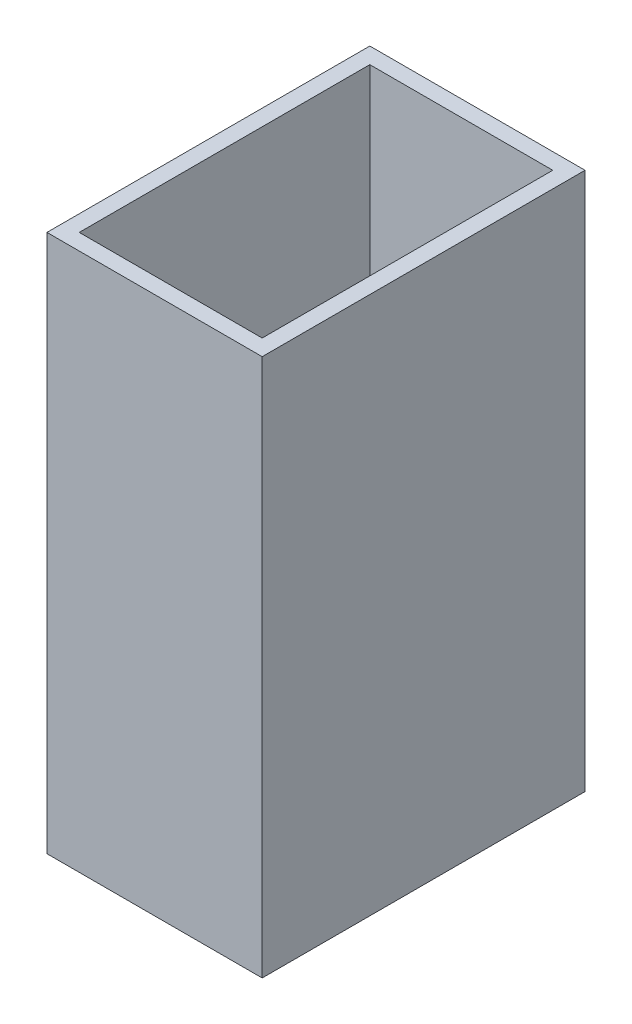
ISO-10303-21;
HEADER;
FILE_DESCRIPTION(('STEP AP214'),'2;1');
FILE_NAME('part.step','',(''),(''),'','','');
FILE_SCHEMA(('AUTOMOTIVE_DESIGN { 1 0 10303 214 1 1 1 1 }'));
ENDSEC;
DATA;
#1=APPLICATION_CONTEXT('core data for automotive mechanical design processes');
#2=APPLICATION_PROTOCOL_DEFINITION('international standard','automotive_design',2000,#1);
#3=PRODUCT_CONTEXT('',#1,'mechanical');
#4=PRODUCT('Part','Part','',(#3));
#5=PRODUCT_RELATED_PRODUCT_CATEGORY('part','',(#4));
#6=PRODUCT_DEFINITION_FORMATION('','',#4);
#7=PRODUCT_DEFINITION_CONTEXT('part definition',#1,'design');
#8=PRODUCT_DEFINITION('design','',#6,#7);
#9=PRODUCT_DEFINITION_SHAPE('','',#8);
#10=(LENGTH_UNIT() NAMED_UNIT(*) SI_UNIT(.MILLI.,.METRE.));
#11=(NAMED_UNIT(*) PLANE_ANGLE_UNIT() SI_UNIT($,.RADIAN.));
#12=(NAMED_UNIT(*) SI_UNIT($,.STERADIAN.) SOLID_ANGLE_UNIT());
#13=UNCERTAINTY_MEASURE_WITH_UNIT(LENGTH_MEASURE(1.E-05),#10,'distance_accuracy_value','');
#14=(GEOMETRIC_REPRESENTATION_CONTEXT(3) GLOBAL_UNCERTAINTY_ASSIGNED_CONTEXT((#13)) GLOBAL_UNIT_ASSIGNED_CONTEXT((#10,
#11,#12)) REPRESENTATION_CONTEXT('',''));
#15=CARTESIAN_POINT('',(0.,0.,0.));
#16=DIRECTION('',(0.,0.,1.));
#17=DIRECTION('',(1.,0.,0.));
#18=AXIS2_PLACEMENT_3D('',#15,#16,#17);
#19=CARTESIAN_POINT('',(0.,100.,0.));
#20=DIRECTION('',(1.,0.,0.));
#21=DIRECTION('',(0.,0.,-1.));
#22=AXIS2_PLACEMENT_3D('',#19,#20,#21);
#23=PLANE('',#22);
#24=DIRECTION('',(0.,0.,1.));
#25=VECTOR('',#24,1.);
#26=CARTESIAN_POINT('',(0.,0.,0.));
#27=LINE('',#26,#25);
#28=CARTESIAN_POINT('',(0.,0.,0.));
#29=VERTEX_POINT('',#28);
#30=CARTESIAN_POINT('',(0.,0.,60.));
#31=VERTEX_POINT('',#30);
#32=EDGE_CURVE('E139',#29,#31,#27,.T.);
#33=ORIENTED_EDGE('',*,*,#32,.T.);
#34=DIRECTION('',(0.,-1.,0.));
#35=VECTOR('',#34,1.);
#36=CARTESIAN_POINT('',(0.,100.,60.));
#37=LINE('',#36,#35);
#38=CARTESIAN_POINT('',(0.,100.,60.));
#39=VERTEX_POINT('',#38);
#40=EDGE_CURVE('E164',#39,#31,#37,.T.);
#41=ORIENTED_EDGE('',*,*,#40,.F.);
#42=DIRECTION('',(0.,0.,1.));
#43=VECTOR('',#42,1.);
#44=CARTESIAN_POINT('',(0.,100.,0.));
#45=LINE('',#44,#43);
#46=CARTESIAN_POINT('',(0.,100.,0.));
#47=VERTEX_POINT('',#46);
#48=EDGE_CURVE('E147',#47,#39,#45,.T.);
#49=ORIENTED_EDGE('',*,*,#48,.F.);
#50=DIRECTION('',(0.,-1.,0.));
#51=VECTOR('',#50,1.);
#52=CARTESIAN_POINT('',(0.,100.,0.));
#53=LINE('',#52,#51);
#54=EDGE_CURVE('E152',#47,#29,#53,.T.);
#55=ORIENTED_EDGE('',*,*,#54,.T.);
#56=EDGE_LOOP('',(#33,#41,#49,#55));
#57=FACE_BOUND('',#56,.T.);
#58=ADVANCED_FACE('F44',(#57),#23,.F.);
#59=CARTESIAN_POINT('',(0.,100.,60.));
#60=DIRECTION('',(0.,0.,-1.));
#61=DIRECTION('',(-1.,0.,0.));
#62=AXIS2_PLACEMENT_3D('',#59,#60,#61);
#63=PLANE('',#62);
#64=DIRECTION('',(1.,0.,0.));
#65=VECTOR('',#64,1.);
#66=CARTESIAN_POINT('',(0.,0.,60.));
#67=LINE('',#66,#65);
#68=CARTESIAN_POINT('',(40.,0.,60.));
#69=VERTEX_POINT('',#68);
#70=EDGE_CURVE('E142',#31,#69,#67,.T.);
#71=ORIENTED_EDGE('',*,*,#70,.T.);
#72=DIRECTION('',(0.,-1.,0.));
#73=VECTOR('',#72,1.);
#74=CARTESIAN_POINT('',(40.,100.,60.));
#75=LINE('',#74,#73);
#76=CARTESIAN_POINT('',(40.,100.,60.));
#77=VERTEX_POINT('',#76);
#78=EDGE_CURVE('E161',#77,#69,#75,.T.);
#79=ORIENTED_EDGE('',*,*,#78,.F.);
#80=DIRECTION('',(1.,0.,0.));
#81=VECTOR('',#80,1.);
#82=CARTESIAN_POINT('',(0.,100.,60.));
#83=LINE('',#82,#81);
#84=EDGE_CURVE('E95',#39,#77,#83,.T.);
#85=ORIENTED_EDGE('',*,*,#84,.F.);
#86=ORIENTED_EDGE('',*,*,#40,.T.);
#87=EDGE_LOOP('',(#71,#79,#85,#86));
#88=FACE_BOUND('',#87,.T.);
#89=ADVANCED_FACE('F187',(#88),#63,.F.);
#90=CARTESIAN_POINT('',(40.,100.,0.));
#91=DIRECTION('',(-1.,0.,0.));
#92=DIRECTION('',(0.,0.,1.));
#93=AXIS2_PLACEMENT_3D('',#90,#91,#92);
#94=PLANE('',#93);
#95=DIRECTION('',(0.,0.,-1.));
#96=VECTOR('',#95,1.);
#97=CARTESIAN_POINT('',(40.,0.,0.));
#98=LINE('',#97,#96);
#99=CARTESIAN_POINT('',(40.,0.,0.));
#100=VERTEX_POINT('',#99);
#101=EDGE_CURVE('E155',#69,#100,#98,.T.);
#102=ORIENTED_EDGE('',*,*,#101,.T.);
#103=DIRECTION('',(0.,-1.,0.));
#104=VECTOR('',#103,1.);
#105=CARTESIAN_POINT('',(40.,100.,0.));
#106=LINE('',#105,#104);
#107=CARTESIAN_POINT('',(40.,100.,0.));
#108=VERTEX_POINT('',#107);
#109=EDGE_CURVE('E159',#108,#100,#106,.T.);
#110=ORIENTED_EDGE('',*,*,#109,.F.);
#111=DIRECTION('',(0.,0.,-1.));
#112=VECTOR('',#111,1.);
#113=CARTESIAN_POINT('',(40.,100.,0.));
#114=LINE('',#113,#112);
#115=EDGE_CURVE('E150',#77,#108,#114,.T.);
#116=ORIENTED_EDGE('',*,*,#115,.F.);
#117=ORIENTED_EDGE('',*,*,#78,.T.);
#118=EDGE_LOOP('',(#102,#110,#116,#117));
#119=FACE_BOUND('',#118,.T.);
#120=ADVANCED_FACE('F192',(#119),#94,.F.);
#121=CARTESIAN_POINT('',(0.,100.,0.));
#122=DIRECTION('',(0.,0.,1.));
#123=DIRECTION('',(1.,0.,0.));
#124=AXIS2_PLACEMENT_3D('',#121,#122,#123);
#125=PLANE('',#124);
#126=DIRECTION('',(-1.,0.,0.));
#127=VECTOR('',#126,1.);
#128=CARTESIAN_POINT('',(0.,0.,0.));
#129=LINE('',#128,#127);
#130=EDGE_CURVE('E87',#100,#29,#129,.T.);
#131=ORIENTED_EDGE('',*,*,#130,.T.);
#132=ORIENTED_EDGE('',*,*,#54,.F.);
#133=DIRECTION('',(-1.,0.,0.));
#134=VECTOR('',#133,1.);
#135=CARTESIAN_POINT('',(0.,100.,0.));
#136=LINE('',#135,#134);
#137=EDGE_CURVE('E66',#108,#47,#136,.T.);
#138=ORIENTED_EDGE('',*,*,#137,.F.);
#139=ORIENTED_EDGE('',*,*,#109,.T.);
#140=EDGE_LOOP('',(#131,#132,#138,#139));
#141=FACE_BOUND('',#140,.T.);
#142=ADVANCED_FACE('F181',(#141),#125,.F.);
#143=CARTESIAN_POINT('',(0.,100.,0.));
#144=DIRECTION('',(0.,1.,0.));
#145=DIRECTION('',(0.,0.,1.));
#146=AXIS2_PLACEMENT_3D('',#143,#144,#145);
#147=PLANE('',#146);
#148=DIRECTION('',(-1.,0.,0.));
#149=VECTOR('',#148,1.);
#150=CARTESIAN_POINT('',(0.,100.,3.));
#151=LINE('',#150,#149);
#152=CARTESIAN_POINT('',(37.,100.,3.));
#153=VERTEX_POINT('',#152);
#154=CARTESIAN_POINT('',(3.,100.,3.));
#155=VERTEX_POINT('',#154);
#156=EDGE_CURVE('E12',#153,#155,#151,.T.);
#157=ORIENTED_EDGE('',*,*,#156,.F.);
#158=DIRECTION('',(0.,0.,-1.));
#159=VECTOR('',#158,1.);
#160=CARTESIAN_POINT('',(37.,100.,0.));
#161=LINE('',#160,#159);
#162=CARTESIAN_POINT('',(37.,100.,57.));
#163=VERTEX_POINT('',#162);
#164=EDGE_CURVE('E51',#163,#153,#161,.T.);
#165=ORIENTED_EDGE('',*,*,#164,.F.);
#166=DIRECTION('',(1.,0.,0.));
#167=VECTOR('',#166,1.);
#168=CARTESIAN_POINT('',(0.,100.,57.));
#169=LINE('',#168,#167);
#170=CARTESIAN_POINT('',(3.00000000000001,100.,57.));
#171=VERTEX_POINT('',#170);
#172=EDGE_CURVE('E167',#171,#163,#169,.T.);
#173=ORIENTED_EDGE('',*,*,#172,.F.);
#174=DIRECTION('',(0.,0.,1.));
#175=VECTOR('',#174,1.);
#176=CARTESIAN_POINT('',(3.,100.,0.));
#177=LINE('',#176,#175);
#178=EDGE_CURVE('E135',#155,#171,#177,.T.);
#179=ORIENTED_EDGE('',*,*,#178,.F.);
#180=EDGE_LOOP('',(#157,#165,#173,#179));
#181=FACE_BOUND('',#180,.T.);
#182=ORIENTED_EDGE('',*,*,#48,.T.);
#183=ORIENTED_EDGE('',*,*,#84,.T.);
#184=ORIENTED_EDGE('',*,*,#115,.T.);
#185=ORIENTED_EDGE('',*,*,#137,.T.);
#186=EDGE_LOOP('',(#182,#183,#184,#185));
#187=FACE_BOUND('',#186,.T.);
#188=ADVANCED_FACE('F178',(#181,#187),#147,.T.);
#189=CARTESIAN_POINT('',(0.,0.,0.));
#190=DIRECTION('',(0.,1.,0.));
#191=DIRECTION('',(0.,0.,1.));
#192=AXIS2_PLACEMENT_3D('',#189,#190,#191);
#193=PLANE('',#192);
#194=CARTESIAN_POINT('',(32.7,0.,12.22));
#195=DIRECTION('',(0.,1.,0.));
#196=DIRECTION('',(0.,0.,1.));
#197=AXIS2_PLACEMENT_3D('',#194,#195,#196);
#198=CIRCLE('',#197,2.5);
#199=CARTESIAN_POINT('',(32.7,0.,14.72));
#200=VERTEX_POINT('',#199);
#201=EDGE_CURVE('E303',#200,#200,#198,.T.);
#202=ORIENTED_EDGE('',*,*,#201,.T.);
#203=EDGE_LOOP('',(#202));
#204=FACE_BOUND('',#203,.T.);
#205=CARTESIAN_POINT('',(7.3,0.,12.22));
#206=DIRECTION('',(0.,1.,0.));
#207=DIRECTION('',(0.,0.,1.));
#208=AXIS2_PLACEMENT_3D('',#205,#206,#207);
#209=CIRCLE('',#208,2.5);
#210=CARTESIAN_POINT('',(7.3,0.,14.72));
#211=VERTEX_POINT('',#210);
#212=EDGE_CURVE('E313',#211,#211,#209,.T.);
#213=ORIENTED_EDGE('',*,*,#212,.T.);
#214=EDGE_LOOP('',(#213));
#215=FACE_BOUND('',#214,.T.);
#216=CARTESIAN_POINT('',(7.29999999999999,0.,47.78));
#217=DIRECTION('',(0.,1.,0.));
#218=DIRECTION('',(0.,0.,1.));
#219=AXIS2_PLACEMENT_3D('',#216,#217,#218);
#220=CIRCLE('',#219,2.5);
#221=CARTESIAN_POINT('',(7.29999999999999,0.,50.28));
#222=VERTEX_POINT('',#221);
#223=EDGE_CURVE('E319',#222,#222,#220,.T.);
#224=ORIENTED_EDGE('',*,*,#223,.T.);
#225=EDGE_LOOP('',(#224));
#226=FACE_BOUND('',#225,.T.);
#227=CARTESIAN_POINT('',(32.7,0.,47.78));
#228=DIRECTION('',(0.,1.,0.));
#229=DIRECTION('',(0.,0.,1.));
#230=AXIS2_PLACEMENT_3D('',#227,#228,#229);
#231=CIRCLE('',#230,2.5);
#232=CARTESIAN_POINT('',(32.7,0.,50.28));
#233=VERTEX_POINT('',#232);
#234=EDGE_CURVE('E325',#233,#233,#231,.T.);
#235=ORIENTED_EDGE('',*,*,#234,.T.);
#236=EDGE_LOOP('',(#235));
#237=FACE_BOUND('',#236,.T.);
#238=ORIENTED_EDGE('',*,*,#32,.F.);
#239=ORIENTED_EDGE('',*,*,#130,.F.);
#240=ORIENTED_EDGE('',*,*,#101,.F.);
#241=ORIENTED_EDGE('',*,*,#70,.F.);
#242=EDGE_LOOP('',(#238,#239,#240,#241));
#243=FACE_BOUND('',#242,.T.);
#244=ADVANCED_FACE('F180',(#204,#215,#226,#237,#243),#193,.F.);
#245=CARTESIAN_POINT('',(37.,-63.8122245341753,3.));
#246=DIRECTION('',(0.,0.,-1.));
#247=DIRECTION('',(-1.,0.,0.));
#248=AXIS2_PLACEMENT_3D('',#245,#246,#247);
#249=PLANE('',#248);
#250=ORIENTED_EDGE('',*,*,#156,.T.);
#251=DIRECTION('',(0.,1.,0.));
#252=VECTOR('',#251,1.);
#253=CARTESIAN_POINT('',(3.,-63.8122245341753,3.));
#254=LINE('',#253,#252);
#255=CARTESIAN_POINT('',(3.,9.99999999999999,3.));
#256=VERTEX_POINT('',#255);
#257=EDGE_CURVE('E58',#256,#155,#254,.T.);
#258=ORIENTED_EDGE('',*,*,#257,.F.);
#259=DIRECTION('',(1.,0.,0.));
#260=VECTOR('',#259,1.);
#261=CARTESIAN_POINT('',(37.,9.99999999999999,3.));
#262=LINE('',#261,#260);
#263=CARTESIAN_POINT('',(37.,9.99999999999999,3.));
#264=VERTEX_POINT('',#263);
#265=EDGE_CURVE('E138',#256,#264,#262,.T.);
#266=ORIENTED_EDGE('',*,*,#265,.T.);
#267=DIRECTION('',(0.,1.,0.));
#268=VECTOR('',#267,1.);
#269=CARTESIAN_POINT('',(37.,-63.8122245341753,3.));
#270=LINE('',#269,#268);
#271=EDGE_CURVE('E129',#264,#153,#270,.T.);
#272=ORIENTED_EDGE('',*,*,#271,.T.);
#273=EDGE_LOOP('',(#250,#258,#266,#272));
#274=FACE_BOUND('',#273,.T.);
#275=ADVANCED_FACE('F176',(#274),#249,.F.);
#276=CARTESIAN_POINT('',(37.,-63.8122245341753,57.));
#277=DIRECTION('',(1.,0.,0.));
#278=DIRECTION('',(0.,0.,-1.));
#279=AXIS2_PLACEMENT_3D('',#276,#277,#278);
#280=PLANE('',#279);
#281=ORIENTED_EDGE('',*,*,#164,.T.);
#282=ORIENTED_EDGE('',*,*,#271,.F.);
#283=DIRECTION('',(0.,0.,1.));
#284=VECTOR('',#283,1.);
#285=CARTESIAN_POINT('',(37.,9.99999999999999,57.));
#286=LINE('',#285,#284);
#287=CARTESIAN_POINT('',(37.,9.99999999999999,57.));
#288=VERTEX_POINT('',#287);
#289=EDGE_CURVE('E128',#264,#288,#286,.T.);
#290=ORIENTED_EDGE('',*,*,#289,.T.);
#291=DIRECTION('',(0.,1.,0.));
#292=VECTOR('',#291,1.);
#293=CARTESIAN_POINT('',(37.,-63.8122245341753,57.));
#294=LINE('',#293,#292);
#295=EDGE_CURVE('E124',#288,#163,#294,.T.);
#296=ORIENTED_EDGE('',*,*,#295,.T.);
#297=EDGE_LOOP('',(#281,#282,#290,#296));
#298=FACE_BOUND('',#297,.T.);
#299=ADVANCED_FACE('F172',(#298),#280,.F.);
#300=CARTESIAN_POINT('',(3.00000000000001,-63.8122245341753,57.));
#301=DIRECTION('',(0.,0.,1.));
#302=DIRECTION('',(1.,0.,0.));
#303=AXIS2_PLACEMENT_3D('',#300,#301,#302);
#304=PLANE('',#303);
#305=ORIENTED_EDGE('',*,*,#172,.T.);
#306=ORIENTED_EDGE('',*,*,#295,.F.);
#307=DIRECTION('',(-1.,0.,0.));
#308=VECTOR('',#307,1.);
#309=CARTESIAN_POINT('',(3.00000000000001,9.99999999999999,57.));
#310=LINE('',#309,#308);
#311=CARTESIAN_POINT('',(3.00000000000001,9.99999999999999,57.));
#312=VERTEX_POINT('',#311);
#313=EDGE_CURVE('E118',#288,#312,#310,.T.);
#314=ORIENTED_EDGE('',*,*,#313,.T.);
#315=DIRECTION('',(0.,1.,0.));
#316=VECTOR('',#315,1.);
#317=CARTESIAN_POINT('',(3.00000000000001,-63.8122245341753,57.));
#318=LINE('',#317,#316);
#319=EDGE_CURVE('E121',#312,#171,#318,.T.);
#320=ORIENTED_EDGE('',*,*,#319,.T.);
#321=EDGE_LOOP('',(#305,#306,#314,#320));
#322=FACE_BOUND('',#321,.T.);
#323=ADVANCED_FACE('F120',(#322),#304,.F.);
#324=CARTESIAN_POINT('',(3.,-63.8122245341753,3.));
#325=DIRECTION('',(-1.,0.,0.));
#326=DIRECTION('',(0.,0.,1.));
#327=AXIS2_PLACEMENT_3D('',#324,#325,#326);
#328=PLANE('',#327);
#329=ORIENTED_EDGE('',*,*,#178,.T.);
#330=ORIENTED_EDGE('',*,*,#319,.F.);
#331=DIRECTION('',(0.,0.,-1.));
#332=VECTOR('',#331,1.);
#333=CARTESIAN_POINT('',(3.,9.99999999999999,3.));
#334=LINE('',#333,#332);
#335=EDGE_CURVE('E132',#312,#256,#334,.T.);
#336=ORIENTED_EDGE('',*,*,#335,.T.);
#337=ORIENTED_EDGE('',*,*,#257,.T.);
#338=EDGE_LOOP('',(#329,#330,#336,#337));
#339=FACE_BOUND('',#338,.T.);
#340=ADVANCED_FACE('F131',(#339),#328,.F.);
#341=CARTESIAN_POINT('',(0.,10.,0.));
#342=DIRECTION('',(0.,1.,0.));
#343=DIRECTION('',(0.,0.,1.));
#344=AXIS2_PLACEMENT_3D('',#341,#342,#343);
#345=PLANE('',#344);
#346=CARTESIAN_POINT('',(32.7,10.,12.22));
#347=DIRECTION('',(0.,1.,0.));
#348=DIRECTION('',(0.,0.,1.));
#349=AXIS2_PLACEMENT_3D('',#346,#347,#348);
#350=CIRCLE('',#349,2.5);
#351=CARTESIAN_POINT('',(32.7,10.,14.72));
#352=VERTEX_POINT('',#351);
#353=EDGE_CURVE('E306',#352,#352,#350,.T.);
#354=ORIENTED_EDGE('',*,*,#353,.F.);
#355=EDGE_LOOP('',(#354));
#356=FACE_BOUND('',#355,.T.);
#357=CARTESIAN_POINT('',(7.3,10.,12.22));
#358=DIRECTION('',(0.,1.,0.));
#359=DIRECTION('',(0.,0.,1.));
#360=AXIS2_PLACEMENT_3D('',#357,#358,#359);
#361=CIRCLE('',#360,2.5);
#362=CARTESIAN_POINT('',(7.3,10.,14.72));
#363=VERTEX_POINT('',#362);
#364=EDGE_CURVE('E308',#363,#363,#361,.T.);
#365=ORIENTED_EDGE('',*,*,#364,.F.);
#366=EDGE_LOOP('',(#365));
#367=FACE_BOUND('',#366,.T.);
#368=CARTESIAN_POINT('',(7.29999999999999,10.,47.78));
#369=DIRECTION('',(0.,1.,0.));
#370=DIRECTION('',(0.,0.,1.));
#371=AXIS2_PLACEMENT_3D('',#368,#369,#370);
#372=CIRCLE('',#371,2.5);
#373=CARTESIAN_POINT('',(7.29999999999999,10.,50.28));
#374=VERTEX_POINT('',#373);
#375=EDGE_CURVE('E316',#374,#374,#372,.T.);
#376=ORIENTED_EDGE('',*,*,#375,.F.);
#377=EDGE_LOOP('',(#376));
#378=FACE_BOUND('',#377,.T.);
#379=CARTESIAN_POINT('',(32.7,10.,47.78));
#380=DIRECTION('',(0.,1.,0.));
#381=DIRECTION('',(0.,0.,1.));
#382=AXIS2_PLACEMENT_3D('',#379,#380,#381);
#383=CIRCLE('',#382,2.5);
#384=CARTESIAN_POINT('',(32.7,10.,50.28));
#385=VERTEX_POINT('',#384);
#386=EDGE_CURVE('E322',#385,#385,#383,.T.);
#387=ORIENTED_EDGE('',*,*,#386,.F.);
#388=EDGE_LOOP('',(#387));
#389=FACE_BOUND('',#388,.T.);
#390=ORIENTED_EDGE('',*,*,#265,.F.);
#391=ORIENTED_EDGE('',*,*,#335,.F.);
#392=ORIENTED_EDGE('',*,*,#313,.F.);
#393=ORIENTED_EDGE('',*,*,#289,.F.);
#394=EDGE_LOOP('',(#390,#391,#392,#393));
#395=FACE_BOUND('',#394,.T.);
#396=ADVANCED_FACE('F137',(#356,#367,#378,#389,#395),#345,.T.);
#397=CARTESIAN_POINT('',(32.7,10.,47.78));
#398=DIRECTION('',(0.,1.,0.));
#399=DIRECTION('',(0.,0.,1.));
#400=AXIS2_PLACEMENT_3D('',#397,#398,#399);
#401=CYLINDRICAL_SURFACE('',#400,2.5);
#402=ORIENTED_EDGE('',*,*,#234,.F.);
#403=EDGE_LOOP('',(#402));
#404=FACE_BOUND('',#403,.T.);
#405=ORIENTED_EDGE('',*,*,#386,.T.);
#406=EDGE_LOOP('',(#405));
#407=FACE_BOUND('',#406,.T.);
#408=ADVANCED_FACE('F258',(#404,#407),#401,.F.);
#409=CARTESIAN_POINT('',(7.29999999999999,10.,47.78));
#410=DIRECTION('',(0.,1.,0.));
#411=DIRECTION('',(0.,0.,1.));
#412=AXIS2_PLACEMENT_3D('',#409,#410,#411);
#413=CYLINDRICAL_SURFACE('',#412,2.5);
#414=ORIENTED_EDGE('',*,*,#223,.F.);
#415=EDGE_LOOP('',(#414));
#416=FACE_BOUND('',#415,.T.);
#417=ORIENTED_EDGE('',*,*,#375,.T.);
#418=EDGE_LOOP('',(#417));
#419=FACE_BOUND('',#418,.T.);
#420=ADVANCED_FACE('F268',(#416,#419),#413,.F.);
#421=CARTESIAN_POINT('',(7.3,10.,12.22));
#422=DIRECTION('',(0.,1.,0.));
#423=DIRECTION('',(0.,0.,1.));
#424=AXIS2_PLACEMENT_3D('',#421,#422,#423);
#425=CYLINDRICAL_SURFACE('',#424,2.5);
#426=ORIENTED_EDGE('',*,*,#212,.F.);
#427=EDGE_LOOP('',(#426));
#428=FACE_BOUND('',#427,.T.);
#429=ORIENTED_EDGE('',*,*,#364,.T.);
#430=EDGE_LOOP('',(#429));
#431=FACE_BOUND('',#430,.T.);
#432=ADVANCED_FACE('F278',(#428,#431),#425,.F.);
#433=CARTESIAN_POINT('',(32.7,10.,12.22));
#434=DIRECTION('',(0.,1.,0.));
#435=DIRECTION('',(0.,0.,1.));
#436=AXIS2_PLACEMENT_3D('',#433,#434,#435);
#437=CYLINDRICAL_SURFACE('',#436,2.5);
#438=ORIENTED_EDGE('',*,*,#201,.F.);
#439=EDGE_LOOP('',(#438));
#440=FACE_BOUND('',#439,.T.);
#441=ORIENTED_EDGE('',*,*,#353,.T.);
#442=EDGE_LOOP('',(#441));
#443=FACE_BOUND('',#442,.T.);
#444=ADVANCED_FACE('F288',(#440,#443),#437,.F.);
#445=CLOSED_SHELL('',(#58,#89,#120,#142,#188,#244,#275,#299,#323,#340,#396,#408,#420,#432,#444));
#446=MANIFOLD_SOLID_BREP('B2',#445);
#447=ADVANCED_BREP_SHAPE_REPRESENTATION('',(#18,#446),#14);
#448=SHAPE_DEFINITION_REPRESENTATION(#9,#447);
ENDSEC;
END-ISO-10303-21;
